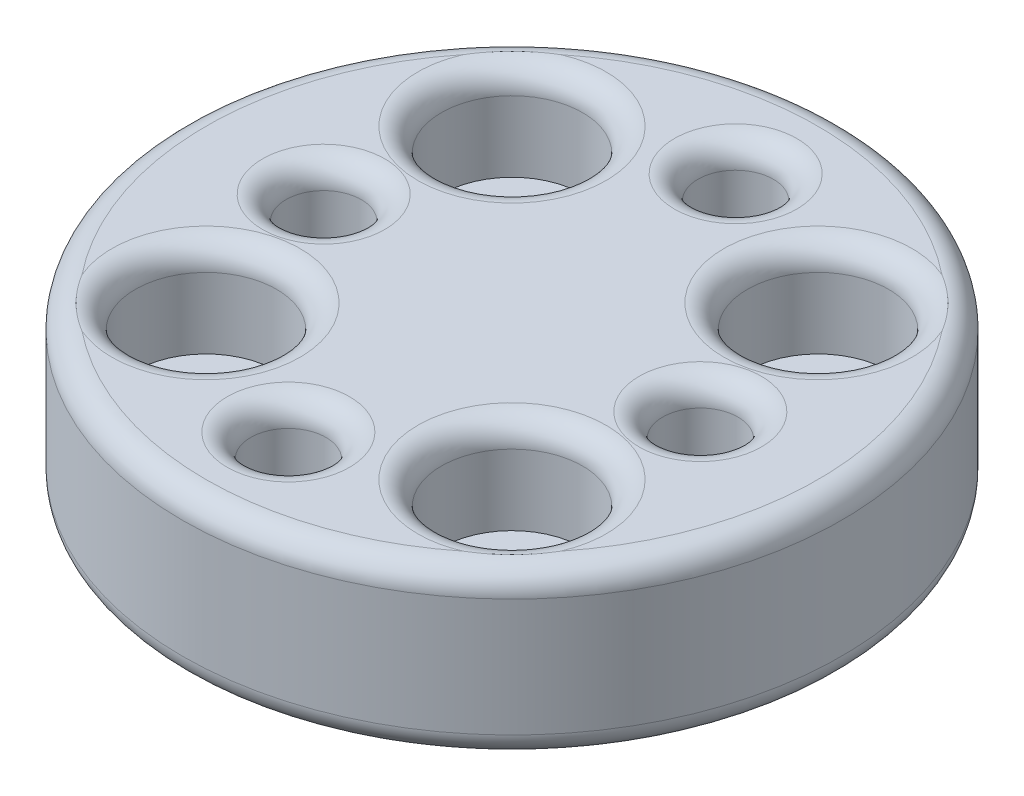
ISO-10303-21;
HEADER;
FILE_DESCRIPTION(('STEP AP214'),'2;1');
FILE_NAME('part.step','',(''),(''),'','','');
FILE_SCHEMA(('AUTOMOTIVE_DESIGN { 1 0 10303 214 1 1 1 1 }'));
ENDSEC;
DATA;
#1=APPLICATION_CONTEXT('core data for automotive mechanical design processes');
#2=APPLICATION_PROTOCOL_DEFINITION('international standard','automotive_design',2000,#1);
#3=PRODUCT_CONTEXT('',#1,'mechanical');
#4=PRODUCT('Part','Part','',(#3));
#5=PRODUCT_RELATED_PRODUCT_CATEGORY('part','',(#4));
#6=PRODUCT_DEFINITION_FORMATION('','',#4);
#7=PRODUCT_DEFINITION_CONTEXT('part definition',#1,'design');
#8=PRODUCT_DEFINITION('design','',#6,#7);
#9=PRODUCT_DEFINITION_SHAPE('','',#8);
#10=(LENGTH_UNIT() NAMED_UNIT(*) SI_UNIT(.MILLI.,.METRE.));
#11=(NAMED_UNIT(*) PLANE_ANGLE_UNIT() SI_UNIT($,.RADIAN.));
#12=(NAMED_UNIT(*) SI_UNIT($,.STERADIAN.) SOLID_ANGLE_UNIT());
#13=UNCERTAINTY_MEASURE_WITH_UNIT(LENGTH_MEASURE(1.E-05),#10,'distance_accuracy_value','');
#14=(GEOMETRIC_REPRESENTATION_CONTEXT(3) GLOBAL_UNCERTAINTY_ASSIGNED_CONTEXT((#13)) GLOBAL_UNIT_ASSIGNED_CONTEXT((#10,
#11,#12)) REPRESENTATION_CONTEXT('',''));
#15=CARTESIAN_POINT('',(0.,0.,0.));
#16=DIRECTION('',(0.,0.,1.));
#17=DIRECTION('',(1.,0.,0.));
#18=AXIS2_PLACEMENT_3D('',#15,#16,#17);
#19=CARTESIAN_POINT('',(0.,7.,0.));
#20=DIRECTION('',(0.,1.,0.));
#21=DIRECTION('',(0.,0.,1.));
#22=AXIS2_PLACEMENT_3D('',#19,#20,#21);
#23=PLANE('',#22);
#24=CARTESIAN_POINT('',(0.,7.,9.5));
#25=DIRECTION('',(0.,1.,0.));
#26=DIRECTION('',(0.,0.,1.));
#27=AXIS2_PLACEMENT_3D('',#24,#25,#26);
#28=CIRCLE('',#27,2.6);
#29=CARTESIAN_POINT('',(0.,7.,12.1));
#30=VERTEX_POINT('',#29);
#31=EDGE_CURVE('E164',#30,#30,#28,.F.);
#32=ORIENTED_EDGE('',*,*,#31,.T.);
#33=EDGE_LOOP('',(#32));
#34=FACE_BOUND('',#33,.T.);
#35=CARTESIAN_POINT('',(8.,7.,0.));
#36=DIRECTION('',(0.,1.,0.));
#37=DIRECTION('',(0.,0.,1.));
#38=AXIS2_PLACEMENT_3D('',#35,#36,#37);
#39=CIRCLE('',#38,2.6);
#40=CARTESIAN_POINT('',(8.,7.,2.6));
#41=VERTEX_POINT('',#40);
#42=EDGE_CURVE('E160',#41,#41,#39,.F.);
#43=ORIENTED_EDGE('',*,*,#42,.T.);
#44=EDGE_LOOP('',(#43));
#45=FACE_BOUND('',#44,.T.);
#46=CARTESIAN_POINT('',(0.,7.,-9.5));
#47=DIRECTION('',(0.,1.,0.));
#48=DIRECTION('',(0.,0.,1.));
#49=AXIS2_PLACEMENT_3D('',#46,#47,#48);
#50=CIRCLE('',#49,2.6);
#51=CARTESIAN_POINT('',(0.,7.,-6.9));
#52=VERTEX_POINT('',#51);
#53=EDGE_CURVE('E156',#52,#52,#50,.F.);
#54=ORIENTED_EDGE('',*,*,#53,.T.);
#55=EDGE_LOOP('',(#54));
#56=FACE_BOUND('',#55,.T.);
#57=CARTESIAN_POINT('',(-8.,7.,0.));
#58=DIRECTION('',(0.,1.,0.));
#59=DIRECTION('',(0.,0.,1.));
#60=AXIS2_PLACEMENT_3D('',#57,#58,#59);
#61=CIRCLE('',#60,2.6);
#62=CARTESIAN_POINT('',(-8.,7.,2.6));
#63=VERTEX_POINT('',#62);
#64=EDGE_CURVE('E152',#63,#63,#61,.F.);
#65=ORIENTED_EDGE('',*,*,#64,.T.);
#66=EDGE_LOOP('',(#65));
#67=FACE_BOUND('',#66,.T.);
#68=CARTESIAN_POINT('',(-6.49999999999966,7.,6.50000000000034));
#69=DIRECTION('',(0.,1.,0.));
#70=DIRECTION('',(0.,0.,1.));
#71=AXIS2_PLACEMENT_3D('',#68,#69,#70);
#72=CIRCLE('',#71,4.);
#73=CARTESIAN_POINT('',(-6.49999999999966,7.,10.5000000000003));
#74=VERTEX_POINT('',#73);
#75=CARTESIAN_POINT('',(-8.10563444448627,7.,10.1635963247444));
#76=VERTEX_POINT('',#75);
#77=EDGE_CURVE('E139',#74,#76,#72,.F.);
#78=ORIENTED_EDGE('',*,*,#77,.T.);
#79=CARTESIAN_POINT('',(0.,7.,0.));
#80=DIRECTION('',(0.,1.,0.));
#81=DIRECTION('',(0.,0.,1.));
#82=AXIS2_PLACEMENT_3D('',#79,#80,#81);
#83=CIRCLE('',#82,13.);
#84=CARTESIAN_POINT('',(0.,7.,13.));
#85=VERTEX_POINT('',#84);
#86=EDGE_CURVE('E63',#76,#85,#83,.T.);
#87=ORIENTED_EDGE('',*,*,#86,.T.);
#88=CARTESIAN_POINT('',(0.,7.,0.));
#89=DIRECTION('',(0.,1.,0.));
#90=DIRECTION('',(0.,0.,1.));
#91=AXIS2_PLACEMENT_3D('',#88,#89,#90);
#92=CIRCLE('',#91,13.);
#93=CARTESIAN_POINT('',(8.10563444448639,7.,10.1635963247443));
#94=VERTEX_POINT('',#93);
#95=EDGE_CURVE('E67',#85,#94,#92,.T.);
#96=ORIENTED_EDGE('',*,*,#95,.T.);
#97=CARTESIAN_POINT('',(6.50000000000034,7.,6.5));
#98=DIRECTION('',(0.,1.,0.));
#99=DIRECTION('',(0.,0.,1.));
#100=AXIS2_PLACEMENT_3D('',#97,#98,#99);
#101=CIRCLE('',#100,4.);
#102=CARTESIAN_POINT('',(6.50000000000034,7.,10.5));
#103=VERTEX_POINT('',#102);
#104=EDGE_CURVE('E145',#94,#103,#101,.F.);
#105=ORIENTED_EDGE('',*,*,#104,.T.);
#106=CARTESIAN_POINT('',(6.50000000000034,7.,6.5));
#107=DIRECTION('',(0.,1.,0.));
#108=DIRECTION('',(0.,0.,1.));
#109=AXIS2_PLACEMENT_3D('',#106,#107,#108);
#110=CIRCLE('',#109,4.);
#111=CARTESIAN_POINT('',(10.1635963247447,7.,8.10563444448585));
#112=VERTEX_POINT('',#111);
#113=EDGE_CURVE('E142',#103,#112,#110,.F.);
#114=ORIENTED_EDGE('',*,*,#113,.T.);
#115=CARTESIAN_POINT('',(0.,7.,0.));
#116=DIRECTION('',(0.,1.,0.));
#117=DIRECTION('',(0.,0.,1.));
#118=AXIS2_PLACEMENT_3D('',#115,#116,#117);
#119=CIRCLE('',#118,13.);
#120=CARTESIAN_POINT('',(10.163596324744,7.,-8.1056344444868));
#121=VERTEX_POINT('',#120);
#122=EDGE_CURVE('E136',#112,#121,#119,.T.);
#123=ORIENTED_EDGE('',*,*,#122,.T.);
#124=CARTESIAN_POINT('',(6.5,7.,-6.5));
#125=DIRECTION('',(0.,1.,0.));
#126=DIRECTION('',(0.,0.,1.));
#127=AXIS2_PLACEMENT_3D('',#124,#125,#126);
#128=CIRCLE('',#127,4.);
#129=CARTESIAN_POINT('',(6.5,7.,-2.5));
#130=VERTEX_POINT('',#129);
#131=EDGE_CURVE('E133',#121,#130,#128,.F.);
#132=ORIENTED_EDGE('',*,*,#131,.T.);
#133=CARTESIAN_POINT('',(6.5,7.,-6.5));
#134=DIRECTION('',(0.,1.,0.));
#135=DIRECTION('',(0.,0.,1.));
#136=AXIS2_PLACEMENT_3D('',#133,#134,#135);
#137=CIRCLE('',#136,4.);
#138=CARTESIAN_POINT('',(8.10563444448679,7.,-10.163596324744));
#139=VERTEX_POINT('',#138);
#140=EDGE_CURVE('E130',#130,#139,#137,.F.);
#141=ORIENTED_EDGE('',*,*,#140,.T.);
#142=CARTESIAN_POINT('',(0.,7.,0.));
#143=DIRECTION('',(0.,1.,0.));
#144=DIRECTION('',(0.,0.,1.));
#145=AXIS2_PLACEMENT_3D('',#142,#143,#144);
#146=CIRCLE('',#145,13.);
#147=CARTESIAN_POINT('',(-8.10563444448774,7.,-10.1635963247432));
#148=VERTEX_POINT('',#147);
#149=EDGE_CURVE('E106',#139,#148,#146,.T.);
#150=ORIENTED_EDGE('',*,*,#149,.T.);
#151=CARTESIAN_POINT('',(-6.5,7.,-6.49999999999966));
#152=DIRECTION('',(0.,1.,0.));
#153=DIRECTION('',(0.,0.,1.));
#154=AXIS2_PLACEMENT_3D('',#151,#152,#153);
#155=CIRCLE('',#154,4.);
#156=CARTESIAN_POINT('',(-6.5,7.,-2.49999999999966));
#157=VERTEX_POINT('',#156);
#158=EDGE_CURVE('E100',#148,#157,#155,.F.);
#159=ORIENTED_EDGE('',*,*,#158,.T.);
#160=CARTESIAN_POINT('',(-6.5,7.,-6.49999999999966));
#161=DIRECTION('',(0.,1.,0.));
#162=DIRECTION('',(0.,0.,1.));
#163=AXIS2_PLACEMENT_3D('',#160,#161,#162);
#164=CIRCLE('',#163,4.);
#165=CARTESIAN_POINT('',(-10.1635963247436,7.,-8.10563444448721));
#166=VERTEX_POINT('',#165);
#167=EDGE_CURVE('E103',#157,#166,#164,.F.);
#168=ORIENTED_EDGE('',*,*,#167,.T.);
#169=CARTESIAN_POINT('',(0.,7.,0.));
#170=DIRECTION('',(0.,1.,0.));
#171=DIRECTION('',(0.,0.,1.));
#172=AXIS2_PLACEMENT_3D('',#169,#170,#171);
#173=CIRCLE('',#172,13.);
#174=CARTESIAN_POINT('',(-10.1635963247436,7.,8.10563444448733));
#175=VERTEX_POINT('',#174);
#176=EDGE_CURVE('E124',#166,#175,#173,.T.);
#177=ORIENTED_EDGE('',*,*,#176,.T.);
#178=CARTESIAN_POINT('',(-6.49999999999966,7.,6.50000000000034));
#179=DIRECTION('',(0.,1.,0.));
#180=DIRECTION('',(0.,0.,1.));
#181=AXIS2_PLACEMENT_3D('',#178,#179,#180);
#182=CIRCLE('',#181,4.);
#183=EDGE_CURVE('E127',#175,#74,#182,.F.);
#184=ORIENTED_EDGE('',*,*,#183,.T.);
#185=EDGE_LOOP('',(#78,#87,#96,#105,#114,#123,#132,#141,#150,#159,#168,#177,#184));
#186=FACE_BOUND('',#185,.T.);
#187=ADVANCED_FACE('F39',(#34,#45,#56,#67,#186),#23,.T.);
#188=CARTESIAN_POINT('',(0.,0.,0.));
#189=DIRECTION('',(0.,1.,0.));
#190=DIRECTION('',(0.,0.,1.));
#191=AXIS2_PLACEMENT_3D('',#188,#189,#190);
#192=PLANE('',#191);
#193=CARTESIAN_POINT('',(0.,0.,9.5));
#194=DIRECTION('',(0.,1.,0.));
#195=DIRECTION('',(0.,0.,1.));
#196=AXIS2_PLACEMENT_3D('',#193,#194,#195);
#197=CIRCLE('',#196,2.6);
#198=CARTESIAN_POINT('',(0.,0.,12.1));
#199=VERTEX_POINT('',#198);
#200=EDGE_CURVE('E392',#199,#199,#197,.T.);
#201=ORIENTED_EDGE('',*,*,#200,.T.);
#202=EDGE_LOOP('',(#201));
#203=FACE_BOUND('',#202,.T.);
#204=CARTESIAN_POINT('',(-8.,0.,0.));
#205=DIRECTION('',(0.,1.,0.));
#206=DIRECTION('',(0.,0.,1.));
#207=AXIS2_PLACEMENT_3D('',#204,#205,#206);
#208=CIRCLE('',#207,2.6);
#209=CARTESIAN_POINT('',(-8.,0.,2.6));
#210=VERTEX_POINT('',#209);
#211=EDGE_CURVE('E388',#210,#210,#208,.T.);
#212=ORIENTED_EDGE('',*,*,#211,.T.);
#213=EDGE_LOOP('',(#212));
#214=FACE_BOUND('',#213,.T.);
#215=CARTESIAN_POINT('',(8.,0.,0.));
#216=DIRECTION('',(0.,1.,0.));
#217=DIRECTION('',(0.,0.,1.));
#218=AXIS2_PLACEMENT_3D('',#215,#216,#217);
#219=CIRCLE('',#218,2.6);
#220=CARTESIAN_POINT('',(8.,0.,2.6));
#221=VERTEX_POINT('',#220);
#222=EDGE_CURVE('E384',#221,#221,#219,.T.);
#223=ORIENTED_EDGE('',*,*,#222,.T.);
#224=EDGE_LOOP('',(#223));
#225=FACE_BOUND('',#224,.T.);
#226=CARTESIAN_POINT('',(0.,0.,-9.5));
#227=DIRECTION('',(0.,1.,0.));
#228=DIRECTION('',(0.,0.,1.));
#229=AXIS2_PLACEMENT_3D('',#226,#227,#228);
#230=CIRCLE('',#229,2.6);
#231=CARTESIAN_POINT('',(0.,0.,-6.9));
#232=VERTEX_POINT('',#231);
#233=EDGE_CURVE('E380',#232,#232,#230,.T.);
#234=ORIENTED_EDGE('',*,*,#233,.T.);
#235=EDGE_LOOP('',(#234));
#236=FACE_BOUND('',#235,.T.);
#237=CARTESIAN_POINT('',(0.,0.,0.));
#238=DIRECTION('',(0.,1.,0.));
#239=DIRECTION('',(0.,0.,1.));
#240=AXIS2_PLACEMENT_3D('',#237,#238,#239);
#241=CIRCLE('',#240,13.);
#242=CARTESIAN_POINT('',(0.,0.,13.));
#243=VERTEX_POINT('',#242);
#244=EDGE_CURVE('E376',#243,#243,#241,.F.);
#245=ORIENTED_EDGE('',*,*,#244,.T.);
#246=EDGE_LOOP('',(#245));
#247=FACE_BOUND('',#246,.T.);
#248=CARTESIAN_POINT('',(-6.5,0.,-6.49999999999966));
#249=DIRECTION('',(0.,1.,0.));
#250=DIRECTION('',(0.,0.,1.));
#251=AXIS2_PLACEMENT_3D('',#248,#249,#250);
#252=CIRCLE('',#251,2.6);
#253=CARTESIAN_POINT('',(-6.5,0.,-3.89999999999966));
#254=VERTEX_POINT('',#253);
#255=EDGE_CURVE('E366',#254,#254,#252,.T.);
#256=ORIENTED_EDGE('',*,*,#255,.T.);
#257=EDGE_LOOP('',(#256));
#258=FACE_BOUND('',#257,.T.);
#259=CARTESIAN_POINT('',(6.49999999999966,0.,-6.5));
#260=DIRECTION('',(0.,1.,0.));
#261=DIRECTION('',(0.,0.,1.));
#262=AXIS2_PLACEMENT_3D('',#259,#260,#261);
#263=CIRCLE('',#262,2.6);
#264=CARTESIAN_POINT('',(6.49999999999966,0.,-3.9));
#265=VERTEX_POINT('',#264);
#266=EDGE_CURVE('E360',#265,#265,#263,.T.);
#267=ORIENTED_EDGE('',*,*,#266,.T.);
#268=EDGE_LOOP('',(#267));
#269=FACE_BOUND('',#268,.T.);
#270=CARTESIAN_POINT('',(6.5,0.,6.49999999999966));
#271=DIRECTION('',(0.,1.,0.));
#272=DIRECTION('',(0.,0.,1.));
#273=AXIS2_PLACEMENT_3D('',#270,#271,#272);
#274=CIRCLE('',#273,2.6);
#275=CARTESIAN_POINT('',(6.5,0.,9.09999999999966));
#276=VERTEX_POINT('',#275);
#277=EDGE_CURVE('E357',#276,#276,#274,.T.);
#278=ORIENTED_EDGE('',*,*,#277,.T.);
#279=EDGE_LOOP('',(#278));
#280=FACE_BOUND('',#279,.T.);
#281=CARTESIAN_POINT('',(-6.49999999999966,0.,6.5));
#282=DIRECTION('',(0.,1.,0.));
#283=DIRECTION('',(0.,0.,1.));
#284=AXIS2_PLACEMENT_3D('',#281,#282,#283);
#285=CIRCLE('',#284,2.6);
#286=CARTESIAN_POINT('',(-6.49999999999966,0.,9.1));
#287=VERTEX_POINT('',#286);
#288=EDGE_CURVE('E361',#287,#287,#285,.T.);
#289=ORIENTED_EDGE('',*,*,#288,.T.);
#290=EDGE_LOOP('',(#289));
#291=FACE_BOUND('',#290,.T.);
#292=ADVANCED_FACE('F245',(#203,#214,#225,#236,#247,#258,#269,#280,#291),#192,.F.);
#293=CARTESIAN_POINT('',(0.,7.,0.));
#294=DIRECTION('',(0.,-1.,0.));
#295=DIRECTION('',(0.,0.,-1.));
#296=AXIS2_PLACEMENT_3D('',#293,#294,#295);
#297=CYLINDRICAL_SURFACE('',#296,14.);
#298=CARTESIAN_POINT('',(0.,1.,0.));
#299=DIRECTION('',(0.,1.,0.));
#300=DIRECTION('',(0.,0.,1.));
#301=AXIS2_PLACEMENT_3D('',#298,#299,#300);
#302=CIRCLE('',#301,14.);
#303=CARTESIAN_POINT('',(0.,1.,14.));
#304=VERTEX_POINT('',#303);
#305=EDGE_CURVE('E337',#304,#304,#302,.T.);
#306=ORIENTED_EDGE('',*,*,#305,.T.);
#307=EDGE_LOOP('',(#306));
#308=FACE_BOUND('',#307,.T.);
#309=CARTESIAN_POINT('',(0.,6.,0.));
#310=DIRECTION('',(0.,1.,0.));
#311=DIRECTION('',(0.,0.,1.));
#312=AXIS2_PLACEMENT_3D('',#309,#310,#311);
#313=CIRCLE('',#312,14.);
#314=CARTESIAN_POINT('',(0.,6.,14.));
#315=VERTEX_POINT('',#314);
#316=EDGE_CURVE('E333',#315,#315,#313,.F.);
#317=ORIENTED_EDGE('',*,*,#316,.T.);
#318=EDGE_LOOP('',(#317));
#319=FACE_BOUND('',#318,.T.);
#320=ADVANCED_FACE('F251',(#308,#319),#297,.T.);
#321=CARTESIAN_POINT('',(0.,7.,-9.5));
#322=DIRECTION('',(0.,-1.,0.));
#323=DIRECTION('',(0.,0.,-1.));
#324=AXIS2_PLACEMENT_3D('',#321,#322,#323);
#325=CYLINDRICAL_SURFACE('',#324,1.6);
#326=CARTESIAN_POINT('',(0.,1.,-9.5));
#327=DIRECTION('',(0.,1.,0.));
#328=DIRECTION('',(0.,0.,1.));
#329=AXIS2_PLACEMENT_3D('',#326,#327,#328);
#330=CIRCLE('',#329,1.6);
#331=CARTESIAN_POINT('',(0.,1.,-7.9));
#332=VERTEX_POINT('',#331);
#333=EDGE_CURVE('E329',#332,#332,#330,.F.);
#334=ORIENTED_EDGE('',*,*,#333,.T.);
#335=EDGE_LOOP('',(#334));
#336=FACE_BOUND('',#335,.T.);
#337=CARTESIAN_POINT('',(0.,6.,-9.5));
#338=DIRECTION('',(0.,1.,0.));
#339=DIRECTION('',(0.,0.,1.));
#340=AXIS2_PLACEMENT_3D('',#337,#338,#339);
#341=CIRCLE('',#340,1.6);
#342=CARTESIAN_POINT('',(0.,6.,-7.9));
#343=VERTEX_POINT('',#342);
#344=EDGE_CURVE('E319',#343,#343,#341,.T.);
#345=ORIENTED_EDGE('',*,*,#344,.T.);
#346=EDGE_LOOP('',(#345));
#347=FACE_BOUND('',#346,.T.);
#348=ADVANCED_FACE('F256',(#336,#347),#325,.F.);
#349=CARTESIAN_POINT('',(8.,7.,0.));
#350=DIRECTION('',(0.,-1.,0.));
#351=DIRECTION('',(0.,0.,-1.));
#352=AXIS2_PLACEMENT_3D('',#349,#350,#351);
#353=CYLINDRICAL_SURFACE('',#352,1.6);
#354=CARTESIAN_POINT('',(8.,1.,0.));
#355=DIRECTION('',(0.,1.,0.));
#356=DIRECTION('',(0.,0.,1.));
#357=AXIS2_PLACEMENT_3D('',#354,#355,#356);
#358=CIRCLE('',#357,1.6);
#359=CARTESIAN_POINT('',(8.,1.,1.6));
#360=VERTEX_POINT('',#359);
#361=EDGE_CURVE('E313',#360,#360,#358,.F.);
#362=ORIENTED_EDGE('',*,*,#361,.T.);
#363=EDGE_LOOP('',(#362));
#364=FACE_BOUND('',#363,.T.);
#365=CARTESIAN_POINT('',(8.,6.,0.));
#366=DIRECTION('',(0.,1.,0.));
#367=DIRECTION('',(0.,0.,1.));
#368=AXIS2_PLACEMENT_3D('',#365,#366,#367);
#369=CIRCLE('',#368,1.6);
#370=CARTESIAN_POINT('',(8.,6.,1.6));
#371=VERTEX_POINT('',#370);
#372=EDGE_CURVE('E310',#371,#371,#369,.T.);
#373=ORIENTED_EDGE('',*,*,#372,.T.);
#374=EDGE_LOOP('',(#373));
#375=FACE_BOUND('',#374,.T.);
#376=ADVANCED_FACE('F430',(#364,#375),#353,.F.);
#377=CARTESIAN_POINT('',(-8.,7.,0.));
#378=DIRECTION('',(0.,-1.,0.));
#379=DIRECTION('',(0.,0.,-1.));
#380=AXIS2_PLACEMENT_3D('',#377,#378,#379);
#381=CYLINDRICAL_SURFACE('',#380,1.6);
#382=CARTESIAN_POINT('',(-8.,1.,0.));
#383=DIRECTION('',(0.,1.,0.));
#384=DIRECTION('',(0.,0.,1.));
#385=AXIS2_PLACEMENT_3D('',#382,#383,#384);
#386=CIRCLE('',#385,1.6);
#387=CARTESIAN_POINT('',(-8.,1.,1.6));
#388=VERTEX_POINT('',#387);
#389=EDGE_CURVE('E314',#388,#388,#386,.F.);
#390=ORIENTED_EDGE('',*,*,#389,.T.);
#391=EDGE_LOOP('',(#390));
#392=FACE_BOUND('',#391,.T.);
#393=CARTESIAN_POINT('',(-8.,6.,0.));
#394=DIRECTION('',(0.,1.,0.));
#395=DIRECTION('',(0.,0.,1.));
#396=AXIS2_PLACEMENT_3D('',#393,#394,#395);
#397=CIRCLE('',#396,1.6);
#398=CARTESIAN_POINT('',(-8.,6.,1.6));
#399=VERTEX_POINT('',#398);
#400=EDGE_CURVE('E322',#399,#399,#397,.T.);
#401=ORIENTED_EDGE('',*,*,#400,.T.);
#402=EDGE_LOOP('',(#401));
#403=FACE_BOUND('',#402,.T.);
#404=ADVANCED_FACE('F407',(#392,#403),#381,.F.);
#405=CARTESIAN_POINT('',(0.,7.,9.5));
#406=DIRECTION('',(0.,-1.,0.));
#407=DIRECTION('',(0.,0.,-1.));
#408=AXIS2_PLACEMENT_3D('',#405,#406,#407);
#409=CYLINDRICAL_SURFACE('',#408,1.6);
#410=CARTESIAN_POINT('',(0.,1.,9.5));
#411=DIRECTION('',(0.,1.,0.));
#412=DIRECTION('',(0.,0.,1.));
#413=AXIS2_PLACEMENT_3D('',#410,#411,#412);
#414=CIRCLE('',#413,1.6);
#415=CARTESIAN_POINT('',(0.,1.,11.1));
#416=VERTEX_POINT('',#415);
#417=EDGE_CURVE('E400',#416,#416,#414,.F.);
#418=ORIENTED_EDGE('',*,*,#417,.T.);
#419=EDGE_LOOP('',(#418));
#420=FACE_BOUND('',#419,.T.);
#421=CARTESIAN_POINT('',(0.,6.,9.5));
#422=DIRECTION('',(0.,1.,0.));
#423=DIRECTION('',(0.,0.,1.));
#424=AXIS2_PLACEMENT_3D('',#421,#422,#423);
#425=CIRCLE('',#424,1.6);
#426=CARTESIAN_POINT('',(0.,6.,11.1));
#427=VERTEX_POINT('',#426);
#428=EDGE_CURVE('E396',#427,#427,#425,.T.);
#429=ORIENTED_EDGE('',*,*,#428,.T.);
#430=EDGE_LOOP('',(#429));
#431=FACE_BOUND('',#430,.T.);
#432=ADVANCED_FACE('F458',(#420,#431),#409,.F.);
#433=CARTESIAN_POINT('',(6.5,3.,-6.5));
#434=DIRECTION('',(0.,1.,0.));
#435=DIRECTION('',(0.,0.,1.));
#436=AXIS2_PLACEMENT_3D('',#433,#434,#435);
#437=CYLINDRICAL_SURFACE('',#436,3.);
#438=CARTESIAN_POINT('',(6.5,6.,-6.5));
#439=DIRECTION('',(0.,1.,0.));
#440=DIRECTION('',(0.,0.,1.));
#441=AXIS2_PLACEMENT_3D('',#438,#439,#440);
#442=CIRCLE('',#441,3.);
#443=CARTESIAN_POINT('',(6.5,6.,-3.5));
#444=VERTEX_POINT('',#443);
#445=EDGE_CURVE('E168',#444,#444,#442,.T.);
#446=ORIENTED_EDGE('',*,*,#445,.T.);
#447=EDGE_LOOP('',(#446));
#448=FACE_BOUND('',#447,.T.);
#449=CARTESIAN_POINT('',(6.5,3.,-6.5));
#450=DIRECTION('',(0.,1.,0.));
#451=DIRECTION('',(0.,0.,1.));
#452=AXIS2_PLACEMENT_3D('',#449,#450,#451);
#453=CIRCLE('',#452,3.);
#454=CARTESIAN_POINT('',(6.5,3.,-3.5));
#455=VERTEX_POINT('',#454);
#456=EDGE_CURVE('E369',#455,#455,#453,.T.);
#457=ORIENTED_EDGE('',*,*,#456,.F.);
#458=EDGE_LOOP('',(#457));
#459=FACE_BOUND('',#458,.T.);
#460=ADVANCED_FACE('F464',(#448,#459),#437,.F.);
#461=CARTESIAN_POINT('',(6.5,3.,-6.5));
#462=DIRECTION('',(0.,1.,0.));
#463=DIRECTION('',(0.,0.,1.));
#464=AXIS2_PLACEMENT_3D('',#461,#462,#463);
#465=PLANE('',#464);
#466=CARTESIAN_POINT('',(6.49999999999966,3.,-6.5));
#467=DIRECTION('',(0.,1.,0.));
#468=DIRECTION('',(0.,0.,1.));
#469=AXIS2_PLACEMENT_3D('',#466,#467,#468);
#470=CIRCLE('',#469,1.6);
#471=CARTESIAN_POINT('',(6.49999999999966,3.,-4.9));
#472=VERTEX_POINT('',#471);
#473=EDGE_CURVE('E515',#472,#472,#470,.T.);
#474=ORIENTED_EDGE('',*,*,#473,.F.);
#475=EDGE_LOOP('',(#474));
#476=FACE_BOUND('',#475,.T.);
#477=ORIENTED_EDGE('',*,*,#456,.T.);
#478=EDGE_LOOP('',(#477));
#479=FACE_BOUND('',#478,.T.);
#480=ADVANCED_FACE('F468',(#476,#479),#465,.T.);
#481=CARTESIAN_POINT('',(6.50000000000034,3.,6.5));
#482=DIRECTION('',(0.,1.,0.));
#483=DIRECTION('',(0.,0.,1.));
#484=AXIS2_PLACEMENT_3D('',#481,#482,#483);
#485=CYLINDRICAL_SURFACE('',#484,3.);
#486=CARTESIAN_POINT('',(6.50000000000034,6.,6.5));
#487=DIRECTION('',(0.,1.,0.));
#488=DIRECTION('',(0.,0.,1.));
#489=AXIS2_PLACEMENT_3D('',#486,#487,#488);
#490=CIRCLE('',#489,3.);
#491=CARTESIAN_POINT('',(6.50000000000034,6.,9.5));
#492=VERTEX_POINT('',#491);
#493=EDGE_CURVE('E172',#492,#492,#490,.T.);
#494=ORIENTED_EDGE('',*,*,#493,.T.);
#495=EDGE_LOOP('',(#494));
#496=FACE_BOUND('',#495,.T.);
#497=CARTESIAN_POINT('',(6.50000000000034,3.,6.5));
#498=DIRECTION('',(0.,1.,0.));
#499=DIRECTION('',(0.,0.,1.));
#500=AXIS2_PLACEMENT_3D('',#497,#498,#499);
#501=CIRCLE('',#500,3.);
#502=CARTESIAN_POINT('',(6.50000000000034,3.,9.5));
#503=VERTEX_POINT('',#502);
#504=EDGE_CURVE('E536',#503,#503,#501,.T.);
#505=ORIENTED_EDGE('',*,*,#504,.F.);
#506=EDGE_LOOP('',(#505));
#507=FACE_BOUND('',#506,.T.);
#508=ADVANCED_FACE('F472',(#496,#507),#485,.F.);
#509=CARTESIAN_POINT('',(6.50000000000034,3.,6.5));
#510=DIRECTION('',(0.,1.,0.));
#511=DIRECTION('',(0.,0.,1.));
#512=AXIS2_PLACEMENT_3D('',#509,#510,#511);
#513=PLANE('',#512);
#514=CARTESIAN_POINT('',(6.5,3.,6.49999999999966));
#515=DIRECTION('',(0.,1.,0.));
#516=DIRECTION('',(0.,0.,1.));
#517=AXIS2_PLACEMENT_3D('',#514,#515,#516);
#518=CIRCLE('',#517,1.6);
#519=CARTESIAN_POINT('',(6.5,3.,8.09999999999966));
#520=VERTEX_POINT('',#519);
#521=EDGE_CURVE('E518',#520,#520,#518,.T.);
#522=ORIENTED_EDGE('',*,*,#521,.F.);
#523=EDGE_LOOP('',(#522));
#524=FACE_BOUND('',#523,.T.);
#525=ORIENTED_EDGE('',*,*,#504,.T.);
#526=EDGE_LOOP('',(#525));
#527=FACE_BOUND('',#526,.T.);
#528=ADVANCED_FACE('F487',(#524,#527),#513,.T.);
#529=CARTESIAN_POINT('',(-6.49999999999966,3.,6.50000000000034));
#530=DIRECTION('',(0.,1.,0.));
#531=DIRECTION('',(0.,0.,1.));
#532=AXIS2_PLACEMENT_3D('',#529,#530,#531);
#533=CYLINDRICAL_SURFACE('',#532,3.);
#534=CARTESIAN_POINT('',(-6.49999999999966,6.,6.50000000000034));
#535=DIRECTION('',(0.,1.,0.));
#536=DIRECTION('',(0.,0.,1.));
#537=AXIS2_PLACEMENT_3D('',#534,#535,#536);
#538=CIRCLE('',#537,3.);
#539=CARTESIAN_POINT('',(-6.49999999999966,6.,9.50000000000034));
#540=VERTEX_POINT('',#539);
#541=EDGE_CURVE('E55',#540,#540,#538,.T.);
#542=ORIENTED_EDGE('',*,*,#541,.T.);
#543=EDGE_LOOP('',(#542));
#544=FACE_BOUND('',#543,.T.);
#545=CARTESIAN_POINT('',(-6.49999999999966,3.,6.50000000000034));
#546=DIRECTION('',(0.,1.,0.));
#547=DIRECTION('',(0.,0.,1.));
#548=AXIS2_PLACEMENT_3D('',#545,#546,#547);
#549=CIRCLE('',#548,3.);
#550=CARTESIAN_POINT('',(-6.49999999999966,3.,9.50000000000034));
#551=VERTEX_POINT('',#550);
#552=EDGE_CURVE('E522',#551,#551,#549,.T.);
#553=ORIENTED_EDGE('',*,*,#552,.F.);
#554=EDGE_LOOP('',(#553));
#555=FACE_BOUND('',#554,.T.);
#556=ADVANCED_FACE('F484',(#544,#555),#533,.F.);
#557=CARTESIAN_POINT('',(-6.49999999999966,3.,6.50000000000034));
#558=DIRECTION('',(0.,1.,0.));
#559=DIRECTION('',(0.,0.,1.));
#560=AXIS2_PLACEMENT_3D('',#557,#558,#559);
#561=PLANE('',#560);
#562=CARTESIAN_POINT('',(-6.49999999999966,3.,6.5));
#563=DIRECTION('',(0.,1.,0.));
#564=DIRECTION('',(0.,0.,1.));
#565=AXIS2_PLACEMENT_3D('',#562,#563,#564);
#566=CIRCLE('',#565,1.6);
#567=CARTESIAN_POINT('',(-6.49999999999966,3.,8.1));
#568=VERTEX_POINT('',#567);
#569=EDGE_CURVE('E525',#568,#568,#566,.T.);
#570=ORIENTED_EDGE('',*,*,#569,.F.);
#571=EDGE_LOOP('',(#570));
#572=FACE_BOUND('',#571,.T.);
#573=ORIENTED_EDGE('',*,*,#552,.T.);
#574=EDGE_LOOP('',(#573));
#575=FACE_BOUND('',#574,.T.);
#576=ADVANCED_FACE('F478',(#572,#575),#561,.T.);
#577=CARTESIAN_POINT('',(-6.5,3.,-6.49999999999966));
#578=DIRECTION('',(0.,1.,0.));
#579=DIRECTION('',(0.,0.,1.));
#580=AXIS2_PLACEMENT_3D('',#577,#578,#579);
#581=CYLINDRICAL_SURFACE('',#580,3.);
#582=CARTESIAN_POINT('',(-6.5,6.,-6.49999999999966));
#583=DIRECTION('',(0.,1.,0.));
#584=DIRECTION('',(0.,0.,1.));
#585=AXIS2_PLACEMENT_3D('',#582,#583,#584);
#586=CIRCLE('',#585,3.);
#587=CARTESIAN_POINT('',(-6.5,6.,-3.49999999999966));
#588=VERTEX_POINT('',#587);
#589=EDGE_CURVE('E11',#588,#588,#586,.T.);
#590=ORIENTED_EDGE('',*,*,#589,.T.);
#591=EDGE_LOOP('',(#590));
#592=FACE_BOUND('',#591,.T.);
#593=CARTESIAN_POINT('',(-6.5,3.,-6.49999999999966));
#594=DIRECTION('',(0.,1.,0.));
#595=DIRECTION('',(0.,0.,1.));
#596=AXIS2_PLACEMENT_3D('',#593,#594,#595);
#597=CIRCLE('',#596,3.);
#598=CARTESIAN_POINT('',(-6.5,3.,-3.49999999999966));
#599=VERTEX_POINT('',#598);
#600=EDGE_CURVE('E517',#599,#599,#597,.T.);
#601=ORIENTED_EDGE('',*,*,#600,.F.);
#602=EDGE_LOOP('',(#601));
#603=FACE_BOUND('',#602,.T.);
#604=ADVANCED_FACE('F474',(#592,#603),#581,.F.);
#605=CARTESIAN_POINT('',(-6.5,3.,-6.49999999999966));
#606=DIRECTION('',(0.,1.,0.));
#607=DIRECTION('',(0.,0.,1.));
#608=AXIS2_PLACEMENT_3D('',#605,#606,#607);
#609=PLANE('',#608);
#610=CARTESIAN_POINT('',(-6.5,3.,-6.49999999999966));
#611=DIRECTION('',(0.,1.,0.));
#612=DIRECTION('',(0.,0.,1.));
#613=AXIS2_PLACEMENT_3D('',#610,#611,#612);
#614=CIRCLE('',#613,1.6);
#615=CARTESIAN_POINT('',(-6.5,3.,-4.89999999999966));
#616=VERTEX_POINT('',#615);
#617=EDGE_CURVE('E224',#616,#616,#614,.T.);
#618=ORIENTED_EDGE('',*,*,#617,.F.);
#619=EDGE_LOOP('',(#618));
#620=FACE_BOUND('',#619,.T.);
#621=ORIENTED_EDGE('',*,*,#600,.T.);
#622=EDGE_LOOP('',(#621));
#623=FACE_BOUND('',#622,.T.);
#624=ADVANCED_FACE('F477',(#620,#623),#609,.T.);
#625=CARTESIAN_POINT('',(-6.5,0.,-6.49999999999966));
#626=DIRECTION('',(0.,1.,0.));
#627=DIRECTION('',(0.,0.,1.));
#628=AXIS2_PLACEMENT_3D('',#625,#626,#627);
#629=CYLINDRICAL_SURFACE('',#628,1.6);
#630=CARTESIAN_POINT('',(-6.5,1.,-6.49999999999966));
#631=DIRECTION('',(0.,1.,0.));
#632=DIRECTION('',(0.,0.,1.));
#633=AXIS2_PLACEMENT_3D('',#630,#631,#632);
#634=CIRCLE('',#633,1.6);
#635=CARTESIAN_POINT('',(-6.5,1.,-4.89999999999966));
#636=VERTEX_POINT('',#635);
#637=EDGE_CURVE('E341',#636,#636,#634,.F.);
#638=ORIENTED_EDGE('',*,*,#637,.T.);
#639=EDGE_LOOP('',(#638));
#640=FACE_BOUND('',#639,.T.);
#641=ORIENTED_EDGE('',*,*,#617,.T.);
#642=EDGE_LOOP('',(#641));
#643=FACE_BOUND('',#642,.T.);
#644=ADVANCED_FACE('F482',(#640,#643),#629,.F.);
#645=CARTESIAN_POINT('',(-6.49999999999966,0.,6.5));
#646=DIRECTION('',(0.,1.,0.));
#647=DIRECTION('',(0.,0.,1.));
#648=AXIS2_PLACEMENT_3D('',#645,#646,#647);
#649=CYLINDRICAL_SURFACE('',#648,1.6);
#650=CARTESIAN_POINT('',(-6.49999999999966,1.,6.5));
#651=DIRECTION('',(0.,1.,0.));
#652=DIRECTION('',(0.,0.,1.));
#653=AXIS2_PLACEMENT_3D('',#650,#651,#652);
#654=CIRCLE('',#653,1.6);
#655=CARTESIAN_POINT('',(-6.49999999999966,1.,8.1));
#656=VERTEX_POINT('',#655);
#657=EDGE_CURVE('E114',#656,#656,#654,.F.);
#658=ORIENTED_EDGE('',*,*,#657,.T.);
#659=EDGE_LOOP('',(#658));
#660=FACE_BOUND('',#659,.T.);
#661=ORIENTED_EDGE('',*,*,#569,.T.);
#662=EDGE_LOOP('',(#661));
#663=FACE_BOUND('',#662,.T.);
#664=ADVANCED_FACE('F500',(#660,#663),#649,.F.);
#665=CARTESIAN_POINT('',(6.5,0.,6.49999999999966));
#666=DIRECTION('',(0.,1.,0.));
#667=DIRECTION('',(0.,0.,1.));
#668=AXIS2_PLACEMENT_3D('',#665,#666,#667);
#669=CYLINDRICAL_SURFACE('',#668,1.6);
#670=CARTESIAN_POINT('',(6.5,1.,6.49999999999966));
#671=DIRECTION('',(0.,1.,0.));
#672=DIRECTION('',(0.,0.,1.));
#673=AXIS2_PLACEMENT_3D('',#670,#671,#672);
#674=CIRCLE('',#673,1.6);
#675=CARTESIAN_POINT('',(6.5,1.,8.09999999999966));
#676=VERTEX_POINT('',#675);
#677=EDGE_CURVE('E118',#676,#676,#674,.F.);
#678=ORIENTED_EDGE('',*,*,#677,.T.);
#679=EDGE_LOOP('',(#678));
#680=FACE_BOUND('',#679,.T.);
#681=ORIENTED_EDGE('',*,*,#521,.T.);
#682=EDGE_LOOP('',(#681));
#683=FACE_BOUND('',#682,.T.);
#684=ADVANCED_FACE('F352',(#680,#683),#669,.F.);
#685=CARTESIAN_POINT('',(6.49999999999966,0.,-6.5));
#686=DIRECTION('',(0.,1.,0.));
#687=DIRECTION('',(0.,0.,1.));
#688=AXIS2_PLACEMENT_3D('',#685,#686,#687);
#689=CYLINDRICAL_SURFACE('',#688,1.6);
#690=CARTESIAN_POINT('',(6.49999999999966,1.,-6.5));
#691=DIRECTION('',(0.,1.,0.));
#692=DIRECTION('',(0.,0.,1.));
#693=AXIS2_PLACEMENT_3D('',#690,#691,#692);
#694=CIRCLE('',#693,1.6);
#695=CARTESIAN_POINT('',(6.49999999999966,1.,-4.9));
#696=VERTEX_POINT('',#695);
#697=EDGE_CURVE('E345',#696,#696,#694,.F.);
#698=ORIENTED_EDGE('',*,*,#697,.T.);
#699=EDGE_LOOP('',(#698));
#700=FACE_BOUND('',#699,.T.);
#701=ORIENTED_EDGE('',*,*,#473,.T.);
#702=EDGE_LOOP('',(#701));
#703=FACE_BOUND('',#702,.T.);
#704=ADVANCED_FACE('F266',(#700,#703),#689,.F.);
#705=CARTESIAN_POINT('',(0.,1.,9.5));
#706=DIRECTION('',(0.,1.,0.));
#707=DIRECTION('',(0.,0.,1.));
#708=AXIS2_PLACEMENT_3D('',#705,#706,#707);
#709=TOROIDAL_SURFACE('',#708,2.6,1.);
#710=ORIENTED_EDGE('',*,*,#417,.F.);
#711=EDGE_LOOP('',(#710));
#712=FACE_BOUND('',#711,.T.);
#713=ORIENTED_EDGE('',*,*,#200,.F.);
#714=EDGE_LOOP('',(#713));
#715=FACE_BOUND('',#714,.T.);
#716=ADVANCED_FACE('F262',(#712,#715),#709,.T.);
#717=CARTESIAN_POINT('',(-8.,1.,0.));
#718=DIRECTION('',(0.,1.,0.));
#719=DIRECTION('',(0.,0.,1.));
#720=AXIS2_PLACEMENT_3D('',#717,#718,#719);
#721=TOROIDAL_SURFACE('',#720,2.6,1.);
#722=ORIENTED_EDGE('',*,*,#389,.F.);
#723=EDGE_LOOP('',(#722));
#724=FACE_BOUND('',#723,.T.);
#725=ORIENTED_EDGE('',*,*,#211,.F.);
#726=EDGE_LOOP('',(#725));
#727=FACE_BOUND('',#726,.T.);
#728=ADVANCED_FACE('F265',(#724,#727),#721,.T.);
#729=CARTESIAN_POINT('',(8.,1.,0.));
#730=DIRECTION('',(0.,1.,0.));
#731=DIRECTION('',(0.,0.,1.));
#732=AXIS2_PLACEMENT_3D('',#729,#730,#731);
#733=TOROIDAL_SURFACE('',#732,2.6,1.);
#734=ORIENTED_EDGE('',*,*,#361,.F.);
#735=EDGE_LOOP('',(#734));
#736=FACE_BOUND('',#735,.T.);
#737=ORIENTED_EDGE('',*,*,#222,.F.);
#738=EDGE_LOOP('',(#737));
#739=FACE_BOUND('',#738,.T.);
#740=ADVANCED_FACE('F270',(#736,#739),#733,.T.);
#741=CARTESIAN_POINT('',(0.,1.,-9.5));
#742=DIRECTION('',(0.,1.,0.));
#743=DIRECTION('',(0.,0.,1.));
#744=AXIS2_PLACEMENT_3D('',#741,#742,#743);
#745=TOROIDAL_SURFACE('',#744,2.6,1.);
#746=ORIENTED_EDGE('',*,*,#333,.F.);
#747=EDGE_LOOP('',(#746));
#748=FACE_BOUND('',#747,.T.);
#749=ORIENTED_EDGE('',*,*,#233,.F.);
#750=EDGE_LOOP('',(#749));
#751=FACE_BOUND('',#750,.T.);
#752=ADVANCED_FACE('F274',(#748,#751),#745,.T.);
#753=CARTESIAN_POINT('',(0.,1.,0.));
#754=DIRECTION('',(0.,1.,0.));
#755=DIRECTION('',(0.,0.,1.));
#756=AXIS2_PLACEMENT_3D('',#753,#754,#755);
#757=TOROIDAL_SURFACE('',#756,13.,1.);
#758=ORIENTED_EDGE('',*,*,#244,.F.);
#759=EDGE_LOOP('',(#758));
#760=FACE_BOUND('',#759,.T.);
#761=ORIENTED_EDGE('',*,*,#305,.F.);
#762=EDGE_LOOP('',(#761));
#763=FACE_BOUND('',#762,.T.);
#764=ADVANCED_FACE('F278',(#760,#763),#757,.T.);
#765=CARTESIAN_POINT('',(-6.5,1.,-6.49999999999966));
#766=DIRECTION('',(0.,1.,0.));
#767=DIRECTION('',(0.,0.,1.));
#768=AXIS2_PLACEMENT_3D('',#765,#766,#767);
#769=TOROIDAL_SURFACE('',#768,2.6,1.);
#770=ORIENTED_EDGE('',*,*,#637,.F.);
#771=EDGE_LOOP('',(#770));
#772=FACE_BOUND('',#771,.T.);
#773=ORIENTED_EDGE('',*,*,#255,.F.);
#774=EDGE_LOOP('',(#773));
#775=FACE_BOUND('',#774,.T.);
#776=ADVANCED_FACE('F282',(#772,#775),#769,.T.);
#777=CARTESIAN_POINT('',(6.49999999999966,1.,-6.5));
#778=DIRECTION('',(0.,1.,0.));
#779=DIRECTION('',(0.,0.,1.));
#780=AXIS2_PLACEMENT_3D('',#777,#778,#779);
#781=TOROIDAL_SURFACE('',#780,2.6,1.);
#782=ORIENTED_EDGE('',*,*,#697,.F.);
#783=EDGE_LOOP('',(#782));
#784=FACE_BOUND('',#783,.T.);
#785=ORIENTED_EDGE('',*,*,#266,.F.);
#786=EDGE_LOOP('',(#785));
#787=FACE_BOUND('',#786,.T.);
#788=ADVANCED_FACE('F286',(#784,#787),#781,.T.);
#789=CARTESIAN_POINT('',(6.5,1.,6.49999999999966));
#790=DIRECTION('',(0.,1.,0.));
#791=DIRECTION('',(0.,0.,1.));
#792=AXIS2_PLACEMENT_3D('',#789,#790,#791);
#793=TOROIDAL_SURFACE('',#792,2.6,1.);
#794=ORIENTED_EDGE('',*,*,#677,.F.);
#795=EDGE_LOOP('',(#794));
#796=FACE_BOUND('',#795,.T.);
#797=ORIENTED_EDGE('',*,*,#277,.F.);
#798=EDGE_LOOP('',(#797));
#799=FACE_BOUND('',#798,.T.);
#800=ADVANCED_FACE('F290',(#796,#799),#793,.T.);
#801=CARTESIAN_POINT('',(-6.49999999999966,1.,6.5));
#802=DIRECTION('',(0.,1.,0.));
#803=DIRECTION('',(0.,0.,1.));
#804=AXIS2_PLACEMENT_3D('',#801,#802,#803);
#805=TOROIDAL_SURFACE('',#804,2.6,1.);
#806=ORIENTED_EDGE('',*,*,#657,.F.);
#807=EDGE_LOOP('',(#806));
#808=FACE_BOUND('',#807,.T.);
#809=ORIENTED_EDGE('',*,*,#288,.F.);
#810=EDGE_LOOP('',(#809));
#811=FACE_BOUND('',#810,.T.);
#812=ADVANCED_FACE('F294',(#808,#811),#805,.T.);
#813=CARTESIAN_POINT('',(0.,6.,9.5));
#814=DIRECTION('',(0.,1.,0.));
#815=DIRECTION('',(0.,0.,1.));
#816=AXIS2_PLACEMENT_3D('',#813,#814,#815);
#817=TOROIDAL_SURFACE('',#816,2.6,1.);
#818=ORIENTED_EDGE('',*,*,#31,.F.);
#819=EDGE_LOOP('',(#818));
#820=FACE_BOUND('',#819,.T.);
#821=ORIENTED_EDGE('',*,*,#428,.F.);
#822=EDGE_LOOP('',(#821));
#823=FACE_BOUND('',#822,.T.);
#824=ADVANCED_FACE('F298',(#820,#823),#817,.T.);
#825=CARTESIAN_POINT('',(8.,6.,0.));
#826=DIRECTION('',(0.,1.,0.));
#827=DIRECTION('',(0.,0.,1.));
#828=AXIS2_PLACEMENT_3D('',#825,#826,#827);
#829=TOROIDAL_SURFACE('',#828,2.6,1.);
#830=ORIENTED_EDGE('',*,*,#42,.F.);
#831=EDGE_LOOP('',(#830));
#832=FACE_BOUND('',#831,.T.);
#833=ORIENTED_EDGE('',*,*,#372,.F.);
#834=EDGE_LOOP('',(#833));
#835=FACE_BOUND('',#834,.T.);
#836=ADVANCED_FACE('F241',(#832,#835),#829,.T.);
#837=CARTESIAN_POINT('',(-6.5,6.,-6.49999999999966));
#838=DIRECTION('',(0.,1.,0.));
#839=DIRECTION('',(0.,0.,1.));
#840=AXIS2_PLACEMENT_3D('',#837,#838,#839);
#841=TOROIDAL_SURFACE('',#840,4.,1.);
#842=ORIENTED_EDGE('',*,*,#589,.F.);
#843=EDGE_LOOP('',(#842));
#844=FACE_BOUND('',#843,.T.);
#845=ORIENTED_EDGE('',*,*,#167,.F.);
#846=ORIENTED_EDGE('',*,*,#158,.F.);
#847=CARTESIAN_POINT('',(-8.10563444448775,7.,-10.1635963247432));
#848=CARTESIAN_POINT('',(-8.1091928065862,6.99999998868785,-10.1614481309188));
#849=CARTESIAN_POINT('',(-8.11274903766323,6.99999955315672,-10.1592963088106));
#850=CARTESIAN_POINT('',(-8.26133088821986,6.99996398815851,-10.0691860135116));
#851=CARTESIAN_POINT('',(-8.40279476431818,6.99923793864866,-9.97519681475409));
#852=CARTESIAN_POINT('',(-8.67743710762749,6.99762997695569,-9.77565842836441));
#853=CARTESIAN_POINT('',(-8.81060911217231,6.99674794520648,-9.67010039657264));
#854=CARTESIAN_POINT('',(-9.06774009460386,6.99557224278169,-9.44796771887579));
#855=CARTESIAN_POINT('',(-9.19168714323776,6.99527932160777,-9.33137923646575));
#856=CARTESIAN_POINT('',(-9.42918924594774,6.99548983423328,-9.08818378508678));
#857=CARTESIAN_POINT('',(-9.54275023340857,6.99599281030561,-8.96158261427233));
#858=CARTESIAN_POINT('',(-9.74366387505034,6.99732775434379,-8.71762714073447));
#859=CARTESIAN_POINT('',(-9.83246070256028,6.99810387272411,-8.60145589092579));
#860=CARTESIAN_POINT('',(-10.0013638510053,6.99942421035587,-8.36316606856304));
#861=CARTESIAN_POINT('',(-10.0814821433414,6.9999687521662,-8.24105603415605));
#862=CARTESIAN_POINT('',(-10.159296304322,6.99999955569233,-8.112749042334));
#863=CARTESIAN_POINT('',(-10.1614481264224,6.99999999129126,-8.10919281122992));
#864=CARTESIAN_POINT('',(-10.1635963247436,7.,-8.10563444448721));
#865=B_SPLINE_CURVE_WITH_KNOTS('',3,(#847,#848,#849,#850,#851,#852,#853,#854,#855,#856,#857,
#858,#859,#860,#861,#862,#863,#864),.UNSPECIFIED.,.F.,.F.,(4,2,2,2,2,2,2,2,4),(0.,
0.0124697156511104,0.521307291484362,1.03053661405095,1.54041339976971,2.04999705768188,
2.48831234683078,2.92601509872376,2.93848481437489),.UNSPECIFIED.);
#866=EDGE_CURVE('E43',#166,#148,#865,.F.);
#867=ORIENTED_EDGE('',*,*,#866,.F.);
#868=EDGE_LOOP('',(#845,#846,#867));
#869=FACE_BOUND('',#868,.T.);
#870=ADVANCED_FACE('F111',(#844,#869),#841,.T.);
#871=CARTESIAN_POINT('',(-6.49999999999966,6.,6.50000000000034));
#872=DIRECTION('',(0.,1.,0.));
#873=DIRECTION('',(0.,0.,1.));
#874=AXIS2_PLACEMENT_3D('',#871,#872,#873);
#875=TOROIDAL_SURFACE('',#874,4.,1.);
#876=ORIENTED_EDGE('',*,*,#541,.F.);
#877=EDGE_LOOP('',(#876));
#878=FACE_BOUND('',#877,.T.);
#879=ORIENTED_EDGE('',*,*,#77,.F.);
#880=ORIENTED_EDGE('',*,*,#183,.F.);
#881=CARTESIAN_POINT('',(-8.10563444448626,7.,10.1635963247444));
#882=CARTESIAN_POINT('',(-8.10919280658471,6.99999998868785,10.1614481309199));
#883=CARTESIAN_POINT('',(-8.11274903766174,6.99999955315672,10.1592963088118));
#884=CARTESIAN_POINT('',(-8.26133088821841,6.99996398815851,10.0691860135127));
#885=CARTESIAN_POINT('',(-8.40279476431679,6.99923793864866,9.97519681475529));
#886=CARTESIAN_POINT('',(-8.67743710762621,6.99762997695568,9.77565842836565));
#887=CARTESIAN_POINT('',(-8.81060911217107,6.99674794520647,9.67010039657388));
#888=CARTESIAN_POINT('',(-9.06774009460268,6.99557224278168,9.44796771887708));
#889=CARTESIAN_POINT('',(-9.1916871432366,6.99527932160777,9.33137923646707));
#890=CARTESIAN_POINT('',(-9.4291892459466,6.99548983423325,9.08818378508815));
#891=CARTESIAN_POINT('',(-9.54275023340743,6.99599281030555,8.96158261427369));
#892=CARTESIAN_POINT('',(-9.74366387504949,6.99732775434383,8.71762714073572));
#893=CARTESIAN_POINT('',(-9.8324607025597,6.99810387272425,8.60145589092691));
#894=CARTESIAN_POINT('',(-10.0013638510047,6.99942421035572,8.36316606856357));
#895=CARTESIAN_POINT('',(-10.0814821433407,6.99996875216564,8.24105603415611));
#896=CARTESIAN_POINT('',(-10.1592963043218,6.99999955569234,8.11274904233409));
#897=CARTESIAN_POINT('',(-10.1614481264223,6.99999999129129,8.10919281123002));
#898=CARTESIAN_POINT('',(-10.1635963247435,7.00000000000005,8.10563444448733));
#899=B_SPLINE_CURVE_WITH_KNOTS('',3,(#881,#882,#883,#884,#885,#886,#887,#888,#889,#890,#891,
#892,#893,#894,#895,#896,#897,#898),.UNSPECIFIED.,.F.,.F.,(4,2,2,2,2,2,2,2,4),(0.,
0.0124697156511065,0.521307291484465,1.03053661405114,1.54041339976986,2.04999705768204,
2.48831234683171,2.92601509872556,2.93848481437667),.UNSPECIFIED.);
#900=EDGE_CURVE('E213',#76,#175,#899,.T.);
#901=ORIENTED_EDGE('',*,*,#900,.F.);
#902=EDGE_LOOP('',(#879,#880,#901));
#903=FACE_BOUND('',#902,.T.);
#904=ADVANCED_FACE('F206',(#878,#903),#875,.T.);
#905=CARTESIAN_POINT('',(6.50000000000034,6.,6.5));
#906=DIRECTION('',(0.,1.,0.));
#907=DIRECTION('',(0.,0.,1.));
#908=AXIS2_PLACEMENT_3D('',#905,#906,#907);
#909=TOROIDAL_SURFACE('',#908,4.,1.);
#910=ORIENTED_EDGE('',*,*,#493,.F.);
#911=EDGE_LOOP('',(#910));
#912=FACE_BOUND('',#911,.T.);
#913=ORIENTED_EDGE('',*,*,#113,.F.);
#914=ORIENTED_EDGE('',*,*,#104,.F.);
#915=CARTESIAN_POINT('',(8.10563444448639,7.,10.1635963247443));
#916=CARTESIAN_POINT('',(8.10919280658483,6.99999998868786,10.1614481309198));
#917=CARTESIAN_POINT('',(8.11274903766186,6.99999955315672,10.1592963088117));
#918=CARTESIAN_POINT('',(8.26133088821852,6.99996398815847,10.0691860135127));
#919=CARTESIAN_POINT('',(8.40279476431687,6.99923793864865,9.97519681475525));
#920=CARTESIAN_POINT('',(8.67743710762626,6.99762997695569,9.77565842836566));
#921=CARTESIAN_POINT('',(8.81060911217111,6.99674794520647,9.67010039657391));
#922=CARTESIAN_POINT('',(9.06774009460274,6.99557224278167,9.44796771887715));
#923=CARTESIAN_POINT('',(9.19168714323667,6.99527932160776,9.33137923646714));
#924=CARTESIAN_POINT('',(9.42918924594672,6.99548983423324,9.08818378508824));
#925=CARTESIAN_POINT('',(9.54275023340759,6.99599281030553,8.96158261427381));
#926=CARTESIAN_POINT('',(9.74366387504981,6.99732775434381,8.71762714073556));
#927=CARTESIAN_POINT('',(9.83246070256014,6.99810387272424,8.60145589092644));
#928=CARTESIAN_POINT('',(10.0013638510058,6.99942421035571,8.3631660685627));
#929=CARTESIAN_POINT('',(10.0814821433422,6.99996875216564,8.24105603415517));
#930=CARTESIAN_POINT('',(10.159296304323,6.99999955569234,8.11274904233263));
#931=CARTESIAN_POINT('',(10.1614481264235,6.99999999129129,8.10919281122855));
#932=CARTESIAN_POINT('',(10.1635963247447,7.00000000000005,8.10563444448585));
#933=B_SPLINE_CURVE_WITH_KNOTS('',3,(#915,#916,#917,#918,#919,#920,#921,#922,#923,#924,#925,
#926,#927,#928,#929,#930,#931,#932),.UNSPECIFIED.,.F.,.F.,(4,2,2,2,2,2,2,2,4),(0.,
0.0124697156511008,0.521307291484375,1.03053661405098,1.54041339976973,2.04999705768191,
2.48831234683257,2.92601509872733,2.93848481437845),.UNSPECIFIED.);
#934=EDGE_CURVE('E189',#112,#94,#933,.F.);
#935=ORIENTED_EDGE('',*,*,#934,.F.);
#936=EDGE_LOOP('',(#913,#914,#935));
#937=FACE_BOUND('',#936,.T.);
#938=ADVANCED_FACE('F202',(#912,#937),#909,.T.);
#939=CARTESIAN_POINT('',(6.5,6.,-6.5));
#940=DIRECTION('',(0.,1.,0.));
#941=DIRECTION('',(0.,0.,1.));
#942=AXIS2_PLACEMENT_3D('',#939,#940,#941);
#943=TOROIDAL_SURFACE('',#942,4.,1.);
#944=ORIENTED_EDGE('',*,*,#445,.F.);
#945=EDGE_LOOP('',(#944));
#946=FACE_BOUND('',#945,.T.);
#947=ORIENTED_EDGE('',*,*,#140,.F.);
#948=ORIENTED_EDGE('',*,*,#131,.F.);
#949=CARTESIAN_POINT('',(8.10563444448679,7.,-10.163596324744));
#950=CARTESIAN_POINT('',(8.10919280658524,6.99999998868785,-10.1614481309195));
#951=CARTESIAN_POINT('',(8.11274903766227,6.99999955315672,-10.1592963088114));
#952=CARTESIAN_POINT('',(8.26133088821893,6.99996398815852,-10.0691860135123));
#953=CARTESIAN_POINT('',(8.40279476431727,6.99923793864867,-9.97519681475488));
#954=CARTESIAN_POINT('',(8.67743710762665,6.99762997695568,-9.77565842836524));
#955=CARTESIAN_POINT('',(8.8106091121715,6.99674794520647,-9.67010039657348));
#956=CARTESIAN_POINT('',(9.0677400946031,6.99557224278168,-9.44796771887666));
#957=CARTESIAN_POINT('',(9.19168714323703,6.99527932160776,-9.33137923646663));
#958=CARTESIAN_POINT('',(9.42918924594707,6.99548983423327,-9.08818378508768));
#959=CARTESIAN_POINT('',(9.54275023340793,6.9959928103056,-8.96158261427323));
#960=CARTESIAN_POINT('',(9.74366387504992,6.99732775434378,-8.71762714073518));
#961=CARTESIAN_POINT('',(9.83246070256004,6.9981038727241,-8.6014558909263));
#962=CARTESIAN_POINT('',(10.0013638510053,6.99942421035587,-8.3631660685631));
#963=CARTESIAN_POINT('',(10.0814821433416,6.9999687521662,-8.24105603415586));
#964=CARTESIAN_POINT('',(10.1592963043223,6.99999955569233,-8.11274904233358));
#965=CARTESIAN_POINT('',(10.1614481264227,6.99999999129126,-8.1091928112295));
#966=CARTESIAN_POINT('',(10.163596324744,7.,-8.1056344444868));
#967=B_SPLINE_CURVE_WITH_KNOTS('',3,(#949,#950,#951,#952,#953,#954,#955,#956,#957,#958,#959,
#960,#961,#962,#963,#964,#965,#966),.UNSPECIFIED.,.F.,.F.,(4,2,2,2,2,2,2,2,4),(0.,
0.0124697156511056,0.521307291484402,1.03053661405103,1.54041339976983,2.04999705768204,
2.48831234683176,2.92601509872556,2.93848481437668),.UNSPECIFIED.);
#968=EDGE_CURVE('E179',#139,#121,#967,.T.);
#969=ORIENTED_EDGE('',*,*,#968,.F.);
#970=EDGE_LOOP('',(#947,#948,#969));
#971=FACE_BOUND('',#970,.T.);
#972=ADVANCED_FACE('F198',(#946,#971),#943,.T.);
#973=CARTESIAN_POINT('',(0.,6.,0.));
#974=DIRECTION('',(0.,1.,0.));
#975=DIRECTION('',(0.,0.,1.));
#976=AXIS2_PLACEMENT_3D('',#973,#974,#975);
#977=TOROIDAL_SURFACE('',#976,13.,1.);
#978=ORIENTED_EDGE('',*,*,#316,.F.);
#979=EDGE_LOOP('',(#978));
#980=FACE_BOUND('',#979,.T.);
#981=ORIENTED_EDGE('',*,*,#176,.F.);
#982=ORIENTED_EDGE('',*,*,#866,.T.);
#983=ORIENTED_EDGE('',*,*,#149,.F.);
#984=ORIENTED_EDGE('',*,*,#968,.T.);
#985=ORIENTED_EDGE('',*,*,#122,.F.);
#986=ORIENTED_EDGE('',*,*,#934,.T.);
#987=ORIENTED_EDGE('',*,*,#95,.F.);
#988=ORIENTED_EDGE('',*,*,#86,.F.);
#989=ORIENTED_EDGE('',*,*,#900,.T.);
#990=EDGE_LOOP('',(#981,#982,#983,#984,#985,#986,#987,#988,#989));
#991=FACE_BOUND('',#990,.T.);
#992=ADVANCED_FACE('F201',(#980,#991),#977,.T.);
#993=CARTESIAN_POINT('',(0.,6.,-9.5));
#994=DIRECTION('',(0.,1.,0.));
#995=DIRECTION('',(0.,0.,1.));
#996=AXIS2_PLACEMENT_3D('',#993,#994,#995);
#997=TOROIDAL_SURFACE('',#996,2.6,1.);
#998=ORIENTED_EDGE('',*,*,#53,.F.);
#999=EDGE_LOOP('',(#998));
#1000=FACE_BOUND('',#999,.T.);
#1001=ORIENTED_EDGE('',*,*,#344,.F.);
#1002=EDGE_LOOP('',(#1001));
#1003=FACE_BOUND('',#1002,.T.);
#1004=ADVANCED_FACE('F410',(#1000,#1003),#997,.T.);
#1005=CARTESIAN_POINT('',(-8.,6.,0.));
#1006=DIRECTION('',(0.,1.,0.));
#1007=DIRECTION('',(0.,0.,1.));
#1008=AXIS2_PLACEMENT_3D('',#1005,#1006,#1007);
#1009=TOROIDAL_SURFACE('',#1008,2.6,1.);
#1010=ORIENTED_EDGE('',*,*,#64,.F.);
#1011=EDGE_LOOP('',(#1010));
#1012=FACE_BOUND('',#1011,.T.);
#1013=ORIENTED_EDGE('',*,*,#400,.F.);
#1014=EDGE_LOOP('',(#1013));
#1015=FACE_BOUND('',#1014,.T.);
#1016=ADVANCED_FACE('F41',(#1012,#1015),#1009,.T.);
#1017=CLOSED_SHELL('',(#187,#292,#320,#348,#376,#404,#432,#460,#480,#508,#528,#556,#576,#604,
#624,#644,#664,#684,#704,#716,#728,#740,#752,#764,#776,#788,#800,#812,#824,#836,#870,#904,#938,
#972,#992,#1004,#1016));
#1018=MANIFOLD_SOLID_BREP('B2',#1017);
#1019=ADVANCED_BREP_SHAPE_REPRESENTATION('',(#18,#1018),#14);
#1020=SHAPE_DEFINITION_REPRESENTATION(#9,#1019);
ENDSEC;
END-ISO-10303-21;
